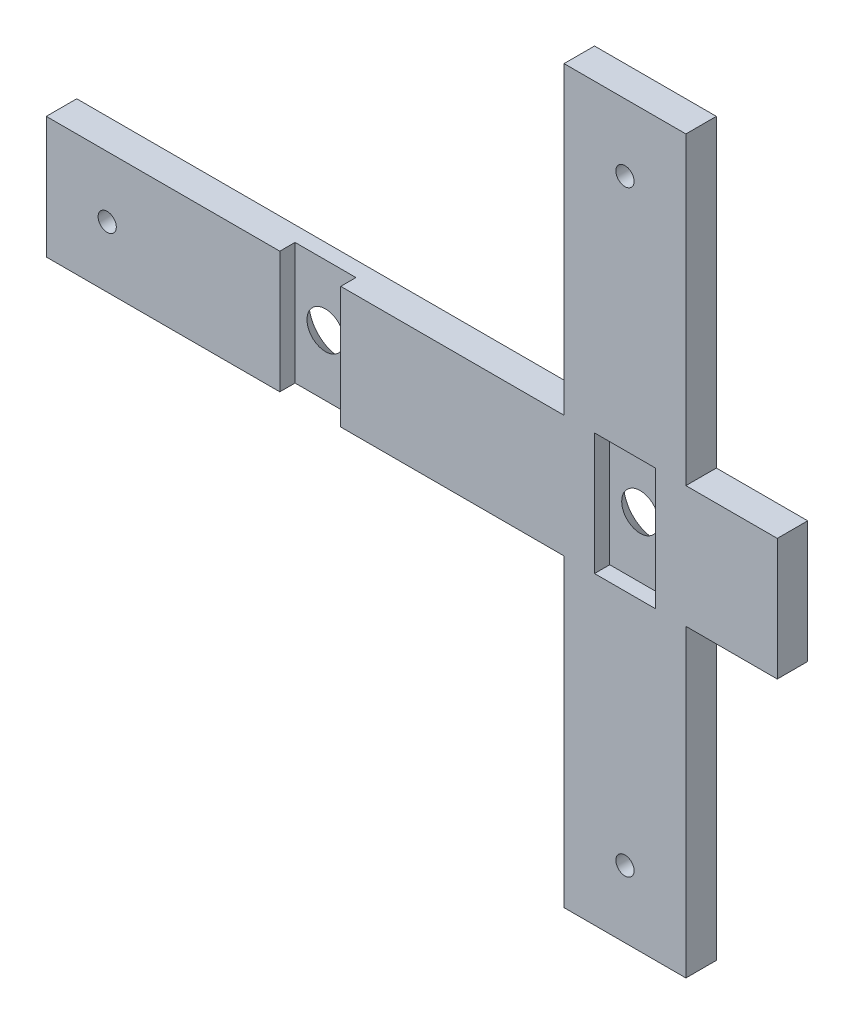
ISO-10303-21;
HEADER;
FILE_DESCRIPTION(('STEP AP214'),'2;1');
FILE_NAME('part.step','',(''),(''),'','','');
FILE_SCHEMA(('AUTOMOTIVE_DESIGN { 1 0 10303 214 1 1 1 1 }'));
ENDSEC;
DATA;
#1=APPLICATION_CONTEXT('core data for automotive mechanical design processes');
#2=APPLICATION_PROTOCOL_DEFINITION('international standard','automotive_design',2000,#1);
#3=PRODUCT_CONTEXT('',#1,'mechanical');
#4=PRODUCT('Part','Part','',(#3));
#5=PRODUCT_RELATED_PRODUCT_CATEGORY('part','',(#4));
#6=PRODUCT_DEFINITION_FORMATION('','',#4);
#7=PRODUCT_DEFINITION_CONTEXT('part definition',#1,'design');
#8=PRODUCT_DEFINITION('design','',#6,#7);
#9=PRODUCT_DEFINITION_SHAPE('','',#8);
#10=(LENGTH_UNIT() NAMED_UNIT(*) SI_UNIT(.MILLI.,.METRE.));
#11=(NAMED_UNIT(*) PLANE_ANGLE_UNIT() SI_UNIT($,.RADIAN.));
#12=(NAMED_UNIT(*) SI_UNIT($,.STERADIAN.) SOLID_ANGLE_UNIT());
#13=UNCERTAINTY_MEASURE_WITH_UNIT(LENGTH_MEASURE(1.E-05),#10,'distance_accuracy_value','');
#14=(GEOMETRIC_REPRESENTATION_CONTEXT(3) GLOBAL_UNCERTAINTY_ASSIGNED_CONTEXT((#13)) GLOBAL_UNIT_ASSIGNED_CONTEXT((#10,
#11,#12)) REPRESENTATION_CONTEXT('',''));
#15=CARTESIAN_POINT('',(0.,0.,0.));
#16=DIRECTION('',(0.,0.,1.));
#17=DIRECTION('',(1.,0.,0.));
#18=AXIS2_PLACEMENT_3D('',#15,#16,#17);
#19=CARTESIAN_POINT('',(44.4499999999993,-8.0538389204271E-06,0.));
#20=DIRECTION('',(0.,0.,-1.));
#21=DIRECTION('',(-1.,0.,0.));
#22=AXIS2_PLACEMENT_3D('',#19,#20,#21);
#23=CONICAL_SURFACE('',#22,6.61924,0.715584993317676);
#24=CARTESIAN_POINT('',(44.4499999999993,-8.0538389204271E-06,0.));
#25=DIRECTION('',(0.,0.,-1.));
#26=DIRECTION('',(-1.,0.,0.));
#27=AXIS2_PLACEMENT_3D('',#24,#25,#26);
#28=CIRCLE('',#27,6.61924);
#29=CARTESIAN_POINT('',(37.8307599999993,-8.0538389204271E-06,0.));
#30=VERTEX_POINT('',#29);
#31=EDGE_CURVE('E250',#30,#30,#28,.T.);
#32=ORIENTED_EDGE('',*,*,#31,.T.);
#33=EDGE_LOOP('',(#32));
#34=FACE_BOUND('',#33,.T.);
#35=CARTESIAN_POINT('',(44.4499999999993,-8.0538389204271E-06,3.175));
#36=DIRECTION('',(0.,0.,1.));
#37=DIRECTION('',(1.,0.,0.));
#38=AXIS2_PLACEMENT_3D('',#35,#36,#37);
#39=CIRCLE('',#38,3.85925460743345);
#40=CARTESIAN_POINT('',(48.3092546074328,-8.0538389204271E-06,3.175));
#41=VERTEX_POINT('',#40);
#42=EDGE_CURVE('E36',#41,#41,#39,.F.);
#43=ORIENTED_EDGE('',*,*,#42,.F.);
#44=EDGE_LOOP('',(#43));
#45=FACE_BOUND('',#44,.T.);
#46=ADVANCED_FACE('F32',(#34,#45),#23,.F.);
#47=CARTESIAN_POINT('',(-76.2,-76.2,6.35));
#48=DIRECTION('',(0.,0.,1.));
#49=DIRECTION('',(1.,0.,0.));
#50=AXIS2_PLACEMENT_3D('',#47,#48,#49);
#51=PLANE('',#50);
#52=DIRECTION('',(-1.,0.,0.));
#53=VECTOR('',#52,1.);
#54=CARTESIAN_POINT('',(50.8,12.7,6.35));
#55=LINE('',#54,#53);
#56=CARTESIAN_POINT('',(50.8,12.7,6.35));
#57=VERTEX_POINT('',#56);
#58=CARTESIAN_POINT('',(38.1,12.7,6.35));
#59=VERTEX_POINT('',#58);
#60=EDGE_CURVE('E49',#57,#59,#55,.T.);
#61=ORIENTED_EDGE('',*,*,#60,.F.);
#62=DIRECTION('',(0.,1.,0.));
#63=VECTOR('',#62,1.);
#64=CARTESIAN_POINT('',(50.8,-12.7,6.35));
#65=LINE('',#64,#63);
#66=CARTESIAN_POINT('',(50.8,-12.7,6.35));
#67=VERTEX_POINT('',#66);
#68=EDGE_CURVE('E193',#67,#57,#65,.T.);
#69=ORIENTED_EDGE('',*,*,#68,.F.);
#70=DIRECTION('',(1.,0.,0.));
#71=VECTOR('',#70,1.);
#72=CARTESIAN_POINT('',(38.1,-12.7,6.35));
#73=LINE('',#72,#71);
#74=CARTESIAN_POINT('',(38.1,-12.7,6.35));
#75=VERTEX_POINT('',#74);
#76=EDGE_CURVE('E196',#75,#67,#73,.T.);
#77=ORIENTED_EDGE('',*,*,#76,.F.);
#78=DIRECTION('',(0.,-1.,0.));
#79=VECTOR('',#78,1.);
#80=CARTESIAN_POINT('',(38.1,12.7,6.35));
#81=LINE('',#80,#79);
#82=EDGE_CURVE('E202',#59,#75,#81,.T.);
#83=ORIENTED_EDGE('',*,*,#82,.F.);
#84=EDGE_LOOP('',(#61,#69,#77,#83));
#85=FACE_BOUND('',#84,.T.);
#86=DIRECTION('',(0.,1.,0.));
#87=VECTOR('',#86,1.);
#88=CARTESIAN_POINT('',(-14.8107400000014,-12.7,6.35));
#89=LINE('',#88,#87);
#90=CARTESIAN_POINT('',(-14.8107400000014,-12.7,6.35));
#91=VERTEX_POINT('',#90);
#92=CARTESIAN_POINT('',(-14.8107400000014,12.6999999999869,6.35));
#93=VERTEX_POINT('',#92);
#94=EDGE_CURVE('E214',#91,#93,#89,.T.);
#95=ORIENTED_EDGE('',*,*,#94,.F.);
#96=DIRECTION('',(1.,0.,0.));
#97=VECTOR('',#96,1.);
#98=CARTESIAN_POINT('',(31.7499999999998,-12.7,6.35));
#99=LINE('',#98,#97);
#100=CARTESIAN_POINT('',(31.7499999999998,-12.7,6.35));
#101=VERTEX_POINT('',#100);
#102=EDGE_CURVE('E256',#91,#101,#99,.T.);
#103=ORIENTED_EDGE('',*,*,#102,.T.);
#104=DIRECTION('',(0.,-1.,0.));
#105=VECTOR('',#104,1.);
#106=CARTESIAN_POINT('',(31.7499999999998,-76.2,6.35));
#107=LINE('',#106,#105);
#108=CARTESIAN_POINT('',(31.7499999999998,-76.2,6.35));
#109=VERTEX_POINT('',#108);
#110=EDGE_CURVE('E282',#101,#109,#107,.T.);
#111=ORIENTED_EDGE('',*,*,#110,.T.);
#112=DIRECTION('',(1.,0.,0.));
#113=VECTOR('',#112,1.);
#114=CARTESIAN_POINT('',(-76.2,-76.2,6.35));
#115=LINE('',#114,#113);
#116=CARTESIAN_POINT('',(57.1499999999998,-76.2,6.35));
#117=VERTEX_POINT('',#116);
#118=EDGE_CURVE('E336',#109,#117,#115,.T.);
#119=ORIENTED_EDGE('',*,*,#118,.T.);
#120=DIRECTION('',(0.,1.,0.));
#121=VECTOR('',#120,1.);
#122=CARTESIAN_POINT('',(57.1499999999998,-12.7,6.35));
#123=LINE('',#122,#121);
#124=CARTESIAN_POINT('',(57.1499999999998,-12.7,6.35));
#125=VERTEX_POINT('',#124);
#126=EDGE_CURVE('E285',#117,#125,#123,.T.);
#127=ORIENTED_EDGE('',*,*,#126,.T.);
#128=DIRECTION('',(1.,0.,0.));
#129=VECTOR('',#128,1.);
#130=CARTESIAN_POINT('',(76.2,-12.7,6.35));
#131=LINE('',#130,#129);
#132=CARTESIAN_POINT('',(76.2,-12.7,6.35));
#133=VERTEX_POINT('',#132);
#134=EDGE_CURVE('E288',#125,#133,#131,.T.);
#135=ORIENTED_EDGE('',*,*,#134,.T.);
#136=DIRECTION('',(0.,1.,0.));
#137=VECTOR('',#136,1.);
#138=CARTESIAN_POINT('',(76.2,76.2,6.35));
#139=LINE('',#138,#137);
#140=CARTESIAN_POINT('',(76.2,12.7,6.35));
#141=VERTEX_POINT('',#140);
#142=EDGE_CURVE('E41',#133,#141,#139,.T.);
#143=ORIENTED_EDGE('',*,*,#142,.T.);
#144=DIRECTION('',(-1.,-6.84601107212256E-13,0.));
#145=VECTOR('',#144,1.);
#146=CARTESIAN_POINT('',(57.1499999999998,12.6999999999869,6.35));
#147=LINE('',#146,#145);
#148=CARTESIAN_POINT('',(57.1499999999998,12.6999999999869,6.35));
#149=VERTEX_POINT('',#148);
#150=EDGE_CURVE('E291',#141,#149,#147,.T.);
#151=ORIENTED_EDGE('',*,*,#150,.T.);
#152=DIRECTION('',(0.,1.,0.));
#153=VECTOR('',#152,1.);
#154=CARTESIAN_POINT('',(57.1499999999998,76.2,6.35));
#155=LINE('',#154,#153);
#156=CARTESIAN_POINT('',(57.1499999999998,76.2,6.35));
#157=VERTEX_POINT('',#156);
#158=EDGE_CURVE('E294',#149,#157,#155,.T.);
#159=ORIENTED_EDGE('',*,*,#158,.T.);
#160=DIRECTION('',(-1.,0.,0.));
#161=VECTOR('',#160,1.);
#162=CARTESIAN_POINT('',(-76.2,76.2,6.35));
#163=LINE('',#162,#161);
#164=CARTESIAN_POINT('',(31.7499999999998,76.2,6.35));
#165=VERTEX_POINT('',#164);
#166=EDGE_CURVE('E12',#157,#165,#163,.T.);
#167=ORIENTED_EDGE('',*,*,#166,.T.);
#168=DIRECTION('',(0.,-1.,0.));
#169=VECTOR('',#168,1.);
#170=CARTESIAN_POINT('',(31.7499999999998,12.6999999999869,6.35));
#171=LINE('',#170,#169);
#172=CARTESIAN_POINT('',(31.7499999999998,12.6999999999869,6.35));
#173=VERTEX_POINT('',#172);
#174=EDGE_CURVE('E297',#165,#173,#171,.T.);
#175=ORIENTED_EDGE('',*,*,#174,.T.);
#176=DIRECTION('',(-1.,1.20940517648925E-13,0.));
#177=VECTOR('',#176,1.);
#178=CARTESIAN_POINT('',(-76.2,12.7,6.35));
#179=LINE('',#178,#177);
#180=EDGE_CURVE('E261',#173,#93,#179,.T.);
#181=ORIENTED_EDGE('',*,*,#180,.T.);
#182=EDGE_LOOP('',(#95,#103,#111,#119,#127,#135,#143,#151,#159,#167,#175,#181));
#183=FACE_BOUND('',#182,.T.);
#184=CARTESIAN_POINT('',(44.4499999999998,-62.23,6.35));
#185=DIRECTION('',(0.,0.,1.));
#186=DIRECTION('',(1.,0.,0.));
#187=AXIS2_PLACEMENT_3D('',#184,#185,#186);
#188=CIRCLE('',#187,1.89864999999999);
#189=CARTESIAN_POINT('',(46.3486499999998,-62.23,6.35));
#190=VERTEX_POINT('',#189);
#191=EDGE_CURVE('E249',#190,#190,#188,.T.);
#192=ORIENTED_EDGE('',*,*,#191,.F.);
#193=EDGE_LOOP('',(#192));
#194=FACE_BOUND('',#193,.T.);
#195=CARTESIAN_POINT('',(44.4499999999998,62.23,6.35));
#196=DIRECTION('',(0.,0.,1.));
#197=DIRECTION('',(1.,0.,0.));
#198=AXIS2_PLACEMENT_3D('',#195,#196,#197);
#199=CIRCLE('',#198,1.89864999999999);
#200=CARTESIAN_POINT('',(46.3486499999998,62.23,6.35));
#201=VERTEX_POINT('',#200);
#202=EDGE_CURVE('E243',#201,#201,#199,.T.);
#203=ORIENTED_EDGE('',*,*,#202,.F.);
#204=EDGE_LOOP('',(#203));
#205=FACE_BOUND('',#204,.T.);
#206=ADVANCED_FACE('F361',(#85,#183,#194,#205),#51,.T.);
#207=CARTESIAN_POINT('',(-21.1607400000014,-8.05383890828404E-06,0.));
#208=DIRECTION('',(0.,0.,-1.));
#209=DIRECTION('',(-1.,0.,0.));
#210=AXIS2_PLACEMENT_3D('',#207,#208,#209);
#211=CONICAL_SURFACE('',#210,6.61924,0.715584993317675);
#212=CARTESIAN_POINT('',(-21.1607400000014,-8.05383890828404E-06,0.));
#213=DIRECTION('',(0.,0.,-1.));
#214=DIRECTION('',(-1.,0.,0.));
#215=AXIS2_PLACEMENT_3D('',#212,#213,#214);
#216=CIRCLE('',#215,6.61924);
#217=CARTESIAN_POINT('',(-27.7799800000014,-8.05383890828404E-06,0.));
#218=VERTEX_POINT('',#217);
#219=EDGE_CURVE('E253',#218,#218,#216,.T.);
#220=ORIENTED_EDGE('',*,*,#219,.T.);
#221=EDGE_LOOP('',(#220));
#222=FACE_BOUND('',#221,.T.);
#223=CARTESIAN_POINT('',(-21.1607400000014,-8.05383890828404E-06,3.175));
#224=DIRECTION('',(0.,0.,1.));
#225=DIRECTION('',(1.,0.,0.));
#226=AXIS2_PLACEMENT_3D('',#223,#224,#225);
#227=CIRCLE('',#226,3.85925460743346);
#228=CARTESIAN_POINT('',(-17.3014853925679,-8.05383890828404E-06,3.175));
#229=VERTEX_POINT('',#228);
#230=EDGE_CURVE('E225',#229,#229,#227,.F.);
#231=ORIENTED_EDGE('',*,*,#230,.F.);
#232=EDGE_LOOP('',(#231));
#233=FACE_BOUND('',#232,.T.);
#234=ADVANCED_FACE('F358',(#222,#233),#211,.F.);
#235=CARTESIAN_POINT('',(-76.2,-76.2,0.));
#236=DIRECTION('',(0.,0.,1.));
#237=DIRECTION('',(1.,0.,0.));
#238=AXIS2_PLACEMENT_3D('',#235,#236,#237);
#239=PLANE('',#238);
#240=DIRECTION('',(-1.,1.20940517648925E-13,0.));
#241=VECTOR('',#240,1.);
#242=CARTESIAN_POINT('',(-76.2,12.7,0.));
#243=LINE('',#242,#241);
#244=CARTESIAN_POINT('',(31.7499999999998,12.6999999999869,0.));
#245=VERTEX_POINT('',#244);
#246=CARTESIAN_POINT('',(-76.2,12.7,0.));
#247=VERTEX_POINT('',#246);
#248=EDGE_CURVE('E276',#245,#247,#243,.T.);
#249=ORIENTED_EDGE('',*,*,#248,.F.);
#250=DIRECTION('',(0.,-1.,0.));
#251=VECTOR('',#250,1.);
#252=CARTESIAN_POINT('',(31.7499999999998,12.6999999999869,0.));
#253=LINE('',#252,#251);
#254=CARTESIAN_POINT('',(31.7499999999998,76.2,0.));
#255=VERTEX_POINT('',#254);
#256=EDGE_CURVE('E273',#255,#245,#253,.T.);
#257=ORIENTED_EDGE('',*,*,#256,.F.);
#258=DIRECTION('',(-1.,0.,0.));
#259=VECTOR('',#258,1.);
#260=CARTESIAN_POINT('',(-76.2,76.2,0.));
#261=LINE('',#260,#259);
#262=CARTESIAN_POINT('',(57.1499999999998,76.2,0.));
#263=VERTEX_POINT('',#262);
#264=EDGE_CURVE('E337',#263,#255,#261,.T.);
#265=ORIENTED_EDGE('',*,*,#264,.F.);
#266=DIRECTION('',(0.,1.,0.));
#267=VECTOR('',#266,1.);
#268=CARTESIAN_POINT('',(57.1499999999998,76.2,0.));
#269=LINE('',#268,#267);
#270=CARTESIAN_POINT('',(57.1499999999998,12.6999999999869,0.));
#271=VERTEX_POINT('',#270);
#272=EDGE_CURVE('E271',#271,#263,#269,.T.);
#273=ORIENTED_EDGE('',*,*,#272,.F.);
#274=DIRECTION('',(-1.,-6.84601107212256E-13,0.));
#275=VECTOR('',#274,1.);
#276=CARTESIAN_POINT('',(57.1499999999998,12.6999999999869,0.));
#277=LINE('',#276,#275);
#278=CARTESIAN_POINT('',(76.2,12.7,0.));
#279=VERTEX_POINT('',#278);
#280=EDGE_CURVE('E268',#279,#271,#277,.T.);
#281=ORIENTED_EDGE('',*,*,#280,.F.);
#282=DIRECTION('',(0.,1.,0.));
#283=VECTOR('',#282,1.);
#284=CARTESIAN_POINT('',(76.2,76.2,0.));
#285=LINE('',#284,#283);
#286=CARTESIAN_POINT('',(76.2,-12.7,0.));
#287=VERTEX_POINT('',#286);
#288=EDGE_CURVE('E347',#287,#279,#285,.T.);
#289=ORIENTED_EDGE('',*,*,#288,.F.);
#290=DIRECTION('',(1.,0.,0.));
#291=VECTOR('',#290,1.);
#292=CARTESIAN_POINT('',(76.2,-12.7,0.));
#293=LINE('',#292,#291);
#294=CARTESIAN_POINT('',(57.1499999999998,-12.7,0.));
#295=VERTEX_POINT('',#294);
#296=EDGE_CURVE('E266',#295,#287,#293,.T.);
#297=ORIENTED_EDGE('',*,*,#296,.F.);
#298=DIRECTION('',(0.,1.,0.));
#299=VECTOR('',#298,1.);
#300=CARTESIAN_POINT('',(57.1499999999998,-12.7,0.));
#301=LINE('',#300,#299);
#302=CARTESIAN_POINT('',(57.1499999999998,-76.2,0.));
#303=VERTEX_POINT('',#302);
#304=EDGE_CURVE('E263',#303,#295,#301,.T.);
#305=ORIENTED_EDGE('',*,*,#304,.F.);
#306=DIRECTION('',(1.,0.,0.));
#307=VECTOR('',#306,1.);
#308=CARTESIAN_POINT('',(-76.2,-76.2,0.));
#309=LINE('',#308,#307);
#310=CARTESIAN_POINT('',(31.7499999999998,-76.2,0.));
#311=VERTEX_POINT('',#310);
#312=EDGE_CURVE('E344',#311,#303,#309,.T.);
#313=ORIENTED_EDGE('',*,*,#312,.F.);
#314=DIRECTION('',(0.,-1.,0.));
#315=VECTOR('',#314,1.);
#316=CARTESIAN_POINT('',(31.7499999999998,-76.2,0.));
#317=LINE('',#316,#315);
#318=CARTESIAN_POINT('',(31.7499999999998,-12.7,0.));
#319=VERTEX_POINT('',#318);
#320=EDGE_CURVE('E260',#319,#311,#317,.T.);
#321=ORIENTED_EDGE('',*,*,#320,.F.);
#322=DIRECTION('',(1.,0.,0.));
#323=VECTOR('',#322,1.);
#324=CARTESIAN_POINT('',(31.7499999999998,-12.7,0.));
#325=LINE('',#324,#323);
#326=CARTESIAN_POINT('',(-76.2,-12.7,0.));
#327=VERTEX_POINT('',#326);
#328=EDGE_CURVE('E257',#327,#319,#325,.T.);
#329=ORIENTED_EDGE('',*,*,#328,.F.);
#330=DIRECTION('',(0.,-1.,0.));
#331=VECTOR('',#330,1.);
#332=CARTESIAN_POINT('',(-76.2,76.2,0.));
#333=LINE('',#332,#331);
#334=EDGE_CURVE('E306',#247,#327,#333,.T.);
#335=ORIENTED_EDGE('',*,*,#334,.F.);
#336=EDGE_LOOP('',(#249,#257,#265,#273,#281,#289,#297,#305,#313,#321,#329,#335));
#337=FACE_BOUND('',#336,.T.);
#338=ORIENTED_EDGE('',*,*,#219,.F.);
#339=EDGE_LOOP('',(#338));
#340=FACE_BOUND('',#339,.T.);
#341=ORIENTED_EDGE('',*,*,#31,.F.);
#342=EDGE_LOOP('',(#341));
#343=FACE_BOUND('',#342,.T.);
#344=CARTESIAN_POINT('',(44.4499999999998,-62.23,0.));
#345=DIRECTION('',(0.,0.,-1.));
#346=DIRECTION('',(-1.,0.,0.));
#347=AXIS2_PLACEMENT_3D('',#344,#345,#346);
#348=CIRCLE('',#347,1.89864999999999);
#349=CARTESIAN_POINT('',(42.5513499999998,-62.23,0.));
#350=VERTEX_POINT('',#349);
#351=EDGE_CURVE('E246',#350,#350,#348,.T.);
#352=ORIENTED_EDGE('',*,*,#351,.F.);
#353=EDGE_LOOP('',(#352));
#354=FACE_BOUND('',#353,.T.);
#355=CARTESIAN_POINT('',(44.4499999999998,62.23,0.));
#356=DIRECTION('',(0.,0.,-1.));
#357=DIRECTION('',(-1.,0.,0.));
#358=AXIS2_PLACEMENT_3D('',#355,#356,#357);
#359=CIRCLE('',#358,1.89864999999999);
#360=CARTESIAN_POINT('',(42.5513499999998,62.23,0.));
#361=VERTEX_POINT('',#360);
#362=EDGE_CURVE('E240',#361,#361,#359,.T.);
#363=ORIENTED_EDGE('',*,*,#362,.F.);
#364=EDGE_LOOP('',(#363));
#365=FACE_BOUND('',#364,.T.);
#366=CARTESIAN_POINT('',(-63.5,0.,0.));
#367=DIRECTION('',(0.,0.,-1.));
#368=DIRECTION('',(-1.,0.,0.));
#369=AXIS2_PLACEMENT_3D('',#366,#367,#368);
#370=CIRCLE('',#369,1.89864999999999);
#371=CARTESIAN_POINT('',(-65.39865,0.,0.));
#372=VERTEX_POINT('',#371);
#373=EDGE_CURVE('E234',#372,#372,#370,.T.);
#374=ORIENTED_EDGE('',*,*,#373,.F.);
#375=EDGE_LOOP('',(#374));
#376=FACE_BOUND('',#375,.T.);
#377=ADVANCED_FACE('F360',(#337,#340,#343,#354,#365,#376),#239,.F.);
#378=CARTESIAN_POINT('',(-76.2,76.2,6.35));
#379=DIRECTION('',(1.,0.,0.));
#380=DIRECTION('',(0.,0.,-1.));
#381=AXIS2_PLACEMENT_3D('',#378,#379,#380);
#382=PLANE('',#381);
#383=DIRECTION('',(0.,0.,1.));
#384=VECTOR('',#383,1.);
#385=CARTESIAN_POINT('',(-76.2,12.7,0.));
#386=LINE('',#385,#384);
#387=CARTESIAN_POINT('',(-76.2,12.7,6.35));
#388=VERTEX_POINT('',#387);
#389=EDGE_CURVE('E303',#247,#388,#386,.T.);
#390=ORIENTED_EDGE('',*,*,#389,.F.);
#391=ORIENTED_EDGE('',*,*,#334,.T.);
#392=DIRECTION('',(0.,0.,1.));
#393=VECTOR('',#392,1.);
#394=CARTESIAN_POINT('',(-76.2,-12.7,0.));
#395=LINE('',#394,#393);
#396=CARTESIAN_POINT('',(-76.2,-12.7,6.35));
#397=VERTEX_POINT('',#396);
#398=EDGE_CURVE('E278',#327,#397,#395,.T.);
#399=ORIENTED_EDGE('',*,*,#398,.T.);
#400=DIRECTION('',(0.,-1.,0.));
#401=VECTOR('',#400,1.);
#402=CARTESIAN_POINT('',(-76.2,76.2,6.35));
#403=LINE('',#402,#401);
#404=EDGE_CURVE('E333',#388,#397,#403,.T.);
#405=ORIENTED_EDGE('',*,*,#404,.F.);
#406=EDGE_LOOP('',(#390,#391,#399,#405));
#407=FACE_BOUND('',#406,.T.);
#408=ADVANCED_FACE('F34',(#407),#382,.F.);
#409=CARTESIAN_POINT('',(-76.2,-76.2,6.35));
#410=DIRECTION('',(0.,1.,0.));
#411=DIRECTION('',(0.,0.,1.));
#412=AXIS2_PLACEMENT_3D('',#409,#410,#411);
#413=PLANE('',#412);
#414=DIRECTION('',(0.,0.,1.));
#415=VECTOR('',#414,1.);
#416=CARTESIAN_POINT('',(57.1499999999998,-76.2,0.));
#417=LINE('',#416,#415);
#418=EDGE_CURVE('E323',#303,#117,#417,.T.);
#419=ORIENTED_EDGE('',*,*,#418,.T.);
#420=ORIENTED_EDGE('',*,*,#118,.F.);
#421=DIRECTION('',(0.,0.,1.));
#422=VECTOR('',#421,1.);
#423=CARTESIAN_POINT('',(31.7499999999998,-76.2,0.));
#424=LINE('',#423,#422);
#425=EDGE_CURVE('E326',#311,#109,#424,.T.);
#426=ORIENTED_EDGE('',*,*,#425,.F.);
#427=ORIENTED_EDGE('',*,*,#312,.T.);
#428=EDGE_LOOP('',(#419,#420,#426,#427));
#429=FACE_BOUND('',#428,.T.);
#430=ADVANCED_FACE('F574',(#429),#413,.F.);
#431=CARTESIAN_POINT('',(76.2,76.2,6.35));
#432=DIRECTION('',(-1.,0.,0.));
#433=DIRECTION('',(0.,-1.,0.));
#434=AXIS2_PLACEMENT_3D('',#431,#432,#433);
#435=PLANE('',#434);
#436=DIRECTION('',(0.,0.,1.));
#437=VECTOR('',#436,1.);
#438=CARTESIAN_POINT('',(76.2,12.7,0.));
#439=LINE('',#438,#437);
#440=EDGE_CURVE('E316',#279,#141,#439,.T.);
#441=ORIENTED_EDGE('',*,*,#440,.T.);
#442=ORIENTED_EDGE('',*,*,#142,.F.);
#443=DIRECTION('',(0.,0.,1.));
#444=VECTOR('',#443,1.);
#445=CARTESIAN_POINT('',(76.2,-12.7,0.));
#446=LINE('',#445,#444);
#447=EDGE_CURVE('E319',#287,#133,#446,.T.);
#448=ORIENTED_EDGE('',*,*,#447,.F.);
#449=ORIENTED_EDGE('',*,*,#288,.T.);
#450=EDGE_LOOP('',(#441,#442,#448,#449));
#451=FACE_BOUND('',#450,.T.);
#452=ADVANCED_FACE('F582',(#451),#435,.F.);
#453=CARTESIAN_POINT('',(-76.2,76.2,6.35));
#454=DIRECTION('',(0.,-1.,0.));
#455=DIRECTION('',(0.,0.,-1.));
#456=AXIS2_PLACEMENT_3D('',#453,#454,#455);
#457=PLANE('',#456);
#458=DIRECTION('',(0.,0.,1.));
#459=VECTOR('',#458,1.);
#460=CARTESIAN_POINT('',(31.7499999999998,76.2,0.));
#461=LINE('',#460,#459);
#462=EDGE_CURVE('E309',#255,#165,#461,.T.);
#463=ORIENTED_EDGE('',*,*,#462,.T.);
#464=ORIENTED_EDGE('',*,*,#166,.F.);
#465=DIRECTION('',(0.,0.,1.));
#466=VECTOR('',#465,1.);
#467=CARTESIAN_POINT('',(57.1499999999998,76.2,0.));
#468=LINE('',#467,#466);
#469=EDGE_CURVE('E312',#263,#157,#468,.T.);
#470=ORIENTED_EDGE('',*,*,#469,.F.);
#471=ORIENTED_EDGE('',*,*,#264,.T.);
#472=EDGE_LOOP('',(#463,#464,#470,#471));
#473=FACE_BOUND('',#472,.T.);
#474=ADVANCED_FACE('F590',(#473),#457,.F.);
#475=DIRECTION('',(0.,-1.,0.));
#476=VECTOR('',#475,1.);
#477=CARTESIAN_POINT('',(-27.5107400000014,12.6999999999869,6.35));
#478=LINE('',#477,#476);
#479=CARTESIAN_POINT('',(-27.5107400000014,12.6999999999869,6.35));
#480=VERTEX_POINT('',#479);
#481=CARTESIAN_POINT('',(-27.5107400000014,-12.7,6.35));
#482=VERTEX_POINT('',#481);
#483=EDGE_CURVE('E219',#480,#482,#478,.T.);
#484=ORIENTED_EDGE('',*,*,#483,.F.);
#485=EDGE_CURVE('E300',#480,#388,#179,.T.);
#486=ORIENTED_EDGE('',*,*,#485,.T.);
#487=ORIENTED_EDGE('',*,*,#404,.T.);
#488=EDGE_CURVE('E279',#397,#482,#99,.T.);
#489=ORIENTED_EDGE('',*,*,#488,.T.);
#490=EDGE_LOOP('',(#484,#486,#487,#489));
#491=FACE_BOUND('',#490,.T.);
#492=CARTESIAN_POINT('',(-63.5,0.,6.35));
#493=DIRECTION('',(0.,0.,1.));
#494=DIRECTION('',(1.,0.,0.));
#495=AXIS2_PLACEMENT_3D('',#492,#493,#494);
#496=CIRCLE('',#495,1.89864999999999);
#497=CARTESIAN_POINT('',(-61.60135,0.,6.35));
#498=VERTEX_POINT('',#497);
#499=EDGE_CURVE('E237',#498,#498,#496,.T.);
#500=ORIENTED_EDGE('',*,*,#499,.F.);
#501=EDGE_LOOP('',(#500));
#502=FACE_BOUND('',#501,.T.);
#503=ADVANCED_FACE('F372',(#491,#502),#51,.T.);
#504=CARTESIAN_POINT('',(31.7499999999998,-12.7,0.));
#505=DIRECTION('',(0.,-1.,0.));
#506=DIRECTION('',(1.,0.,0.));
#507=AXIS2_PLACEMENT_3D('',#504,#505,#506);
#508=PLANE('',#507);
#509=DIRECTION('',(0.,0.,1.));
#510=VECTOR('',#509,1.);
#511=CARTESIAN_POINT('',(-14.8107400000014,-12.7,3.175));
#512=LINE('',#511,#510);
#513=CARTESIAN_POINT('',(-14.8107400000014,-12.7,3.175));
#514=VERTEX_POINT('',#513);
#515=EDGE_CURVE('E226',#514,#91,#512,.T.);
#516=ORIENTED_EDGE('',*,*,#515,.F.);
#517=DIRECTION('',(-1.,0.,0.));
#518=VECTOR('',#517,1.);
#519=CARTESIAN_POINT('',(31.7499999999998,-12.7,3.175));
#520=LINE('',#519,#518);
#521=CARTESIAN_POINT('',(-27.5107400000014,-12.7,3.175));
#522=VERTEX_POINT('',#521);
#523=EDGE_CURVE('E229',#514,#522,#520,.T.);
#524=ORIENTED_EDGE('',*,*,#523,.T.);
#525=DIRECTION('',(0.,0.,-1.));
#526=VECTOR('',#525,1.);
#527=CARTESIAN_POINT('',(-27.5107400000014,-12.7,0.));
#528=LINE('',#527,#526);
#529=EDGE_CURVE('E232',#482,#522,#528,.T.);
#530=ORIENTED_EDGE('',*,*,#529,.F.);
#531=ORIENTED_EDGE('',*,*,#488,.F.);
#532=ORIENTED_EDGE('',*,*,#398,.F.);
#533=ORIENTED_EDGE('',*,*,#328,.T.);
#534=DIRECTION('',(0.,0.,1.));
#535=VECTOR('',#534,1.);
#536=CARTESIAN_POINT('',(31.7499999999998,-12.7,0.));
#537=LINE('',#536,#535);
#538=EDGE_CURVE('E328',#319,#101,#537,.T.);
#539=ORIENTED_EDGE('',*,*,#538,.T.);
#540=ORIENTED_EDGE('',*,*,#102,.F.);
#541=EDGE_LOOP('',(#516,#524,#530,#531,#532,#533,#539,#540));
#542=FACE_BOUND('',#541,.T.);
#543=ADVANCED_FACE('F557',(#542),#508,.T.);
#544=CARTESIAN_POINT('',(31.7499999999998,-76.2,0.));
#545=DIRECTION('',(-1.,0.,0.));
#546=DIRECTION('',(0.,0.,1.));
#547=AXIS2_PLACEMENT_3D('',#544,#545,#546);
#548=PLANE('',#547);
#549=ORIENTED_EDGE('',*,*,#110,.F.);
#550=ORIENTED_EDGE('',*,*,#538,.F.);
#551=ORIENTED_EDGE('',*,*,#320,.T.);
#552=ORIENTED_EDGE('',*,*,#425,.T.);
#553=EDGE_LOOP('',(#549,#550,#551,#552));
#554=FACE_BOUND('',#553,.T.);
#555=ADVANCED_FACE('F548',(#554),#548,.T.);
#556=CARTESIAN_POINT('',(57.1499999999998,-12.7,0.));
#557=DIRECTION('',(1.,0.,0.));
#558=DIRECTION('',(0.,1.,0.));
#559=AXIS2_PLACEMENT_3D('',#556,#557,#558);
#560=PLANE('',#559);
#561=ORIENTED_EDGE('',*,*,#126,.F.);
#562=ORIENTED_EDGE('',*,*,#418,.F.);
#563=ORIENTED_EDGE('',*,*,#304,.T.);
#564=DIRECTION('',(0.,0.,1.));
#565=VECTOR('',#564,1.);
#566=CARTESIAN_POINT('',(57.1499999999998,-12.7,0.));
#567=LINE('',#566,#565);
#568=EDGE_CURVE('E321',#295,#125,#567,.T.);
#569=ORIENTED_EDGE('',*,*,#568,.T.);
#570=EDGE_LOOP('',(#561,#562,#563,#569));
#571=FACE_BOUND('',#570,.T.);
#572=ADVANCED_FACE('F539',(#571),#560,.T.);
#573=CARTESIAN_POINT('',(76.2,-12.7,0.));
#574=DIRECTION('',(0.,-1.,0.));
#575=DIRECTION('',(0.,0.,-1.));
#576=AXIS2_PLACEMENT_3D('',#573,#574,#575);
#577=PLANE('',#576);
#578=ORIENTED_EDGE('',*,*,#134,.F.);
#579=ORIENTED_EDGE('',*,*,#568,.F.);
#580=ORIENTED_EDGE('',*,*,#296,.T.);
#581=ORIENTED_EDGE('',*,*,#447,.T.);
#582=EDGE_LOOP('',(#578,#579,#580,#581));
#583=FACE_BOUND('',#582,.T.);
#584=ADVANCED_FACE('F530',(#583),#577,.T.);
#585=CARTESIAN_POINT('',(57.1499999999998,12.6999999999869,0.));
#586=DIRECTION('',(-6.84601107212257E-13,1.,0.));
#587=DIRECTION('',(-1.,-6.84601107212257E-13,0.));
#588=AXIS2_PLACEMENT_3D('',#585,#586,#587);
#589=PLANE('',#588);
#590=ORIENTED_EDGE('',*,*,#150,.F.);
#591=ORIENTED_EDGE('',*,*,#440,.F.);
#592=ORIENTED_EDGE('',*,*,#280,.T.);
#593=DIRECTION('',(0.,0.,1.));
#594=VECTOR('',#593,1.);
#595=CARTESIAN_POINT('',(57.1499999999998,12.6999999999869,0.));
#596=LINE('',#595,#594);
#597=EDGE_CURVE('E314',#271,#149,#596,.T.);
#598=ORIENTED_EDGE('',*,*,#597,.T.);
#599=EDGE_LOOP('',(#590,#591,#592,#598));
#600=FACE_BOUND('',#599,.T.);
#601=ADVANCED_FACE('F521',(#600),#589,.T.);
#602=CARTESIAN_POINT('',(57.1499999999998,76.2,0.));
#603=DIRECTION('',(1.,0.,0.));
#604=DIRECTION('',(0.,0.,-1.));
#605=AXIS2_PLACEMENT_3D('',#602,#603,#604);
#606=PLANE('',#605);
#607=ORIENTED_EDGE('',*,*,#158,.F.);
#608=ORIENTED_EDGE('',*,*,#597,.F.);
#609=ORIENTED_EDGE('',*,*,#272,.T.);
#610=ORIENTED_EDGE('',*,*,#469,.T.);
#611=EDGE_LOOP('',(#607,#608,#609,#610));
#612=FACE_BOUND('',#611,.T.);
#613=ADVANCED_FACE('F513',(#612),#606,.T.);
#614=CARTESIAN_POINT('',(-76.2,12.7,0.));
#615=DIRECTION('',(1.20940517648925E-13,1.,0.));
#616=DIRECTION('',(-1.,1.20940517648925E-13,0.));
#617=AXIS2_PLACEMENT_3D('',#614,#615,#616);
#618=PLANE('',#617);
#619=DIRECTION('',(0.,0.,1.));
#620=VECTOR('',#619,1.);
#621=CARTESIAN_POINT('',(-14.8107400000014,12.6999999999869,3.175));
#622=LINE('',#621,#620);
#623=CARTESIAN_POINT('',(-14.8107400000014,12.6999999999926,3.175));
#624=VERTEX_POINT('',#623);
#625=EDGE_CURVE('E222',#624,#93,#622,.T.);
#626=ORIENTED_EDGE('',*,*,#625,.T.);
#627=ORIENTED_EDGE('',*,*,#180,.F.);
#628=DIRECTION('',(0.,0.,1.));
#629=VECTOR('',#628,1.);
#630=CARTESIAN_POINT('',(31.7499999999998,12.6999999999869,0.));
#631=LINE('',#630,#629);
#632=EDGE_CURVE('E307',#245,#173,#631,.T.);
#633=ORIENTED_EDGE('',*,*,#632,.F.);
#634=ORIENTED_EDGE('',*,*,#248,.T.);
#635=ORIENTED_EDGE('',*,*,#389,.T.);
#636=ORIENTED_EDGE('',*,*,#485,.F.);
#637=DIRECTION('',(0.,0.,1.));
#638=VECTOR('',#637,1.);
#639=CARTESIAN_POINT('',(-27.5107400000014,12.6999999999869,3.175));
#640=LINE('',#639,#638);
#641=CARTESIAN_POINT('',(-27.5107400000014,12.6999999999869,3.175));
#642=VERTEX_POINT('',#641);
#643=EDGE_CURVE('E218',#642,#480,#640,.T.);
#644=ORIENTED_EDGE('',*,*,#643,.F.);
#645=DIRECTION('',(-1.,0.,0.));
#646=VECTOR('',#645,1.);
#647=CARTESIAN_POINT('',(-14.8107400000014,12.6999999999869,3.175));
#648=LINE('',#647,#646);
#649=EDGE_CURVE('E211',#624,#642,#648,.T.);
#650=ORIENTED_EDGE('',*,*,#649,.F.);
#651=EDGE_LOOP('',(#626,#627,#633,#634,#635,#636,#644,#650));
#652=FACE_BOUND('',#651,.T.);
#653=ADVANCED_FACE('F504',(#652),#618,.T.);
#654=CARTESIAN_POINT('',(31.7499999999998,12.6999999999869,0.));
#655=DIRECTION('',(-1.,0.,0.));
#656=DIRECTION('',(0.,0.,1.));
#657=AXIS2_PLACEMENT_3D('',#654,#655,#656);
#658=PLANE('',#657);
#659=ORIENTED_EDGE('',*,*,#174,.F.);
#660=ORIENTED_EDGE('',*,*,#462,.F.);
#661=ORIENTED_EDGE('',*,*,#256,.T.);
#662=ORIENTED_EDGE('',*,*,#632,.T.);
#663=EDGE_LOOP('',(#659,#660,#661,#662));
#664=FACE_BOUND('',#663,.T.);
#665=ADVANCED_FACE('F385',(#664),#658,.T.);
#666=CARTESIAN_POINT('',(44.4499999999998,-62.23,0.));
#667=DIRECTION('',(0.,0.,-1.));
#668=DIRECTION('',(-1.,0.,0.));
#669=AXIS2_PLACEMENT_3D('',#666,#667,#668);
#670=CYLINDRICAL_SURFACE('',#669,1.89864999999999);
#671=ORIENTED_EDGE('',*,*,#191,.T.);
#672=EDGE_LOOP('',(#671));
#673=FACE_BOUND('',#672,.T.);
#674=ORIENTED_EDGE('',*,*,#351,.T.);
#675=EDGE_LOOP('',(#674));
#676=FACE_BOUND('',#675,.T.);
#677=ADVANCED_FACE('F381',(#673,#676),#670,.F.);
#678=CARTESIAN_POINT('',(44.4499999999998,62.23,0.));
#679=DIRECTION('',(0.,0.,-1.));
#680=DIRECTION('',(-1.,0.,0.));
#681=AXIS2_PLACEMENT_3D('',#678,#679,#680);
#682=CYLINDRICAL_SURFACE('',#681,1.89864999999999);
#683=ORIENTED_EDGE('',*,*,#202,.T.);
#684=EDGE_LOOP('',(#683));
#685=FACE_BOUND('',#684,.T.);
#686=ORIENTED_EDGE('',*,*,#362,.T.);
#687=EDGE_LOOP('',(#686));
#688=FACE_BOUND('',#687,.T.);
#689=ADVANCED_FACE('F384',(#685,#688),#682,.F.);
#690=CARTESIAN_POINT('',(-63.5,0.,0.));
#691=DIRECTION('',(0.,0.,-1.));
#692=DIRECTION('',(-1.,0.,0.));
#693=AXIS2_PLACEMENT_3D('',#690,#691,#692);
#694=CYLINDRICAL_SURFACE('',#693,1.89864999999999);
#695=ORIENTED_EDGE('',*,*,#499,.T.);
#696=EDGE_LOOP('',(#695));
#697=FACE_BOUND('',#696,.T.);
#698=ORIENTED_EDGE('',*,*,#373,.T.);
#699=EDGE_LOOP('',(#698));
#700=FACE_BOUND('',#699,.T.);
#701=ADVANCED_FACE('F389',(#697,#700),#694,.F.);
#702=CARTESIAN_POINT('',(-27.5107400000014,12.6999999999869,3.175));
#703=DIRECTION('',(0.,0.,1.));
#704=DIRECTION('',(1.,0.,0.));
#705=AXIS2_PLACEMENT_3D('',#702,#703,#704);
#706=PLANE('',#705);
#707=DIRECTION('',(0.,1.,0.));
#708=VECTOR('',#707,1.);
#709=CARTESIAN_POINT('',(-14.8107400000014,-12.7,3.175));
#710=LINE('',#709,#708);
#711=EDGE_CURVE('E57',#514,#624,#710,.T.);
#712=ORIENTED_EDGE('',*,*,#711,.T.);
#713=ORIENTED_EDGE('',*,*,#649,.T.);
#714=DIRECTION('',(0.,-1.,0.));
#715=VECTOR('',#714,1.);
#716=CARTESIAN_POINT('',(-27.5107400000014,12.6999999999869,3.175));
#717=LINE('',#716,#715);
#718=EDGE_CURVE('E213',#642,#522,#717,.T.);
#719=ORIENTED_EDGE('',*,*,#718,.T.);
#720=ORIENTED_EDGE('',*,*,#523,.F.);
#721=EDGE_LOOP('',(#712,#713,#719,#720));
#722=FACE_BOUND('',#721,.T.);
#723=ORIENTED_EDGE('',*,*,#230,.T.);
#724=EDGE_LOOP('',(#723));
#725=FACE_BOUND('',#724,.T.);
#726=ADVANCED_FACE('F356',(#722,#725),#706,.T.);
#727=CARTESIAN_POINT('',(-14.8107400000014,-12.7,3.175));
#728=DIRECTION('',(1.,0.,0.));
#729=DIRECTION('',(0.,0.,-1.));
#730=AXIS2_PLACEMENT_3D('',#727,#728,#729);
#731=PLANE('',#730);
#732=ORIENTED_EDGE('',*,*,#94,.T.);
#733=ORIENTED_EDGE('',*,*,#625,.F.);
#734=ORIENTED_EDGE('',*,*,#711,.F.);
#735=ORIENTED_EDGE('',*,*,#515,.T.);
#736=EDGE_LOOP('',(#732,#733,#734,#735));
#737=FACE_BOUND('',#736,.T.);
#738=ADVANCED_FACE('F397',(#737),#731,.F.);
#739=CARTESIAN_POINT('',(-27.5107400000014,12.6999999999869,3.175));
#740=DIRECTION('',(-1.,0.,0.));
#741=DIRECTION('',(0.,0.,1.));
#742=AXIS2_PLACEMENT_3D('',#739,#740,#741);
#743=PLANE('',#742);
#744=ORIENTED_EDGE('',*,*,#529,.T.);
#745=ORIENTED_EDGE('',*,*,#718,.F.);
#746=ORIENTED_EDGE('',*,*,#643,.T.);
#747=ORIENTED_EDGE('',*,*,#483,.T.);
#748=EDGE_LOOP('',(#744,#745,#746,#747));
#749=FACE_BOUND('',#748,.T.);
#750=ADVANCED_FACE('F394',(#749),#743,.F.);
#751=CARTESIAN_POINT('',(38.1,12.7,3.175));
#752=DIRECTION('',(0.,0.,1.));
#753=DIRECTION('',(1.,0.,0.));
#754=AXIS2_PLACEMENT_3D('',#751,#752,#753);
#755=PLANE('',#754);
#756=DIRECTION('',(-1.,0.,0.));
#757=VECTOR('',#756,1.);
#758=CARTESIAN_POINT('',(50.8,12.7,3.175));
#759=LINE('',#758,#757);
#760=CARTESIAN_POINT('',(50.8,12.7,3.175));
#761=VERTEX_POINT('',#760);
#762=CARTESIAN_POINT('',(38.1,12.7,3.175));
#763=VERTEX_POINT('',#762);
#764=EDGE_CURVE('E174',#761,#763,#759,.T.);
#765=ORIENTED_EDGE('',*,*,#764,.T.);
#766=DIRECTION('',(0.,-1.,0.));
#767=VECTOR('',#766,1.);
#768=CARTESIAN_POINT('',(38.1,12.7,3.175));
#769=LINE('',#768,#767);
#770=CARTESIAN_POINT('',(38.1,-12.7,3.175));
#771=VERTEX_POINT('',#770);
#772=EDGE_CURVE('E183',#763,#771,#769,.T.);
#773=ORIENTED_EDGE('',*,*,#772,.T.);
#774=DIRECTION('',(1.,0.,0.));
#775=VECTOR('',#774,1.);
#776=CARTESIAN_POINT('',(38.1,-12.7,3.175));
#777=LINE('',#776,#775);
#778=CARTESIAN_POINT('',(50.8,-12.7,3.175));
#779=VERTEX_POINT('',#778);
#780=EDGE_CURVE('E188',#771,#779,#777,.T.);
#781=ORIENTED_EDGE('',*,*,#780,.T.);
#782=DIRECTION('',(0.,1.,0.));
#783=VECTOR('',#782,1.);
#784=CARTESIAN_POINT('',(50.8,-12.7,3.175));
#785=LINE('',#784,#783);
#786=EDGE_CURVE('E180',#779,#761,#785,.T.);
#787=ORIENTED_EDGE('',*,*,#786,.T.);
#788=EDGE_LOOP('',(#765,#773,#781,#787));
#789=FACE_BOUND('',#788,.T.);
#790=ORIENTED_EDGE('',*,*,#42,.T.);
#791=EDGE_LOOP('',(#790));
#792=FACE_BOUND('',#791,.T.);
#793=ADVANCED_FACE('F190',(#789,#792),#755,.T.);
#794=CARTESIAN_POINT('',(50.8,12.7,3.175));
#795=DIRECTION('',(0.,1.,0.));
#796=DIRECTION('',(-1.,0.,0.));
#797=AXIS2_PLACEMENT_3D('',#794,#795,#796);
#798=PLANE('',#797);
#799=ORIENTED_EDGE('',*,*,#60,.T.);
#800=DIRECTION('',(0.,0.,1.));
#801=VECTOR('',#800,1.);
#802=CARTESIAN_POINT('',(38.1,12.7,3.175));
#803=LINE('',#802,#801);
#804=EDGE_CURVE('E170',#763,#59,#803,.T.);
#805=ORIENTED_EDGE('',*,*,#804,.F.);
#806=ORIENTED_EDGE('',*,*,#764,.F.);
#807=DIRECTION('',(0.,0.,1.));
#808=VECTOR('',#807,1.);
#809=CARTESIAN_POINT('',(50.8,12.7,3.175));
#810=LINE('',#809,#808);
#811=EDGE_CURVE('E206',#761,#57,#810,.T.);
#812=ORIENTED_EDGE('',*,*,#811,.T.);
#813=EDGE_LOOP('',(#799,#805,#806,#812));
#814=FACE_BOUND('',#813,.T.);
#815=ADVANCED_FACE('F172',(#814),#798,.F.);
#816=CARTESIAN_POINT('',(50.8,-12.7,3.175));
#817=DIRECTION('',(1.,0.,0.));
#818=DIRECTION('',(0.,0.,-1.));
#819=AXIS2_PLACEMENT_3D('',#816,#817,#818);
#820=PLANE('',#819);
#821=ORIENTED_EDGE('',*,*,#68,.T.);
#822=ORIENTED_EDGE('',*,*,#811,.F.);
#823=ORIENTED_EDGE('',*,*,#786,.F.);
#824=DIRECTION('',(0.,0.,1.));
#825=VECTOR('',#824,1.);
#826=CARTESIAN_POINT('',(50.8,-12.7,3.175));
#827=LINE('',#826,#825);
#828=EDGE_CURVE('E208',#779,#67,#827,.T.);
#829=ORIENTED_EDGE('',*,*,#828,.T.);
#830=EDGE_LOOP('',(#821,#822,#823,#829));
#831=FACE_BOUND('',#830,.T.);
#832=ADVANCED_FACE('F406',(#831),#820,.F.);
#833=CARTESIAN_POINT('',(38.1,-12.7,3.175));
#834=DIRECTION('',(0.,-1.,0.));
#835=DIRECTION('',(1.,0.,0.));
#836=AXIS2_PLACEMENT_3D('',#833,#834,#835);
#837=PLANE('',#836);
#838=ORIENTED_EDGE('',*,*,#76,.T.);
#839=ORIENTED_EDGE('',*,*,#828,.F.);
#840=ORIENTED_EDGE('',*,*,#780,.F.);
#841=DIRECTION('',(0.,0.,1.));
#842=VECTOR('',#841,1.);
#843=CARTESIAN_POINT('',(38.1,-12.7,3.175));
#844=LINE('',#843,#842);
#845=EDGE_CURVE('E179',#771,#75,#844,.T.);
#846=ORIENTED_EDGE('',*,*,#845,.T.);
#847=EDGE_LOOP('',(#838,#839,#840,#846));
#848=FACE_BOUND('',#847,.T.);
#849=ADVANCED_FACE('F409',(#848),#837,.F.);
#850=CARTESIAN_POINT('',(38.1,12.7,3.175));
#851=DIRECTION('',(-1.,0.,0.));
#852=DIRECTION('',(0.,0.,1.));
#853=AXIS2_PLACEMENT_3D('',#850,#851,#852);
#854=PLANE('',#853);
#855=ORIENTED_EDGE('',*,*,#82,.T.);
#856=ORIENTED_EDGE('',*,*,#845,.F.);
#857=ORIENTED_EDGE('',*,*,#772,.F.);
#858=ORIENTED_EDGE('',*,*,#804,.T.);
#859=EDGE_LOOP('',(#855,#856,#857,#858));
#860=FACE_BOUND('',#859,.T.);
#861=ADVANCED_FACE('F184',(#860),#854,.F.);
#862=CLOSED_SHELL('',(#46,#206,#234,#377,#408,#430,#452,#474,#503,#543,#555,#572,#584,#601,#613,
#653,#665,#677,#689,#701,#726,#738,#750,#793,#815,#832,#849,#861));
#863=MANIFOLD_SOLID_BREP('B2',#862);
#864=ADVANCED_BREP_SHAPE_REPRESENTATION('',(#18,#863),#14);
#865=SHAPE_DEFINITION_REPRESENTATION(#9,#864);
ENDSEC;
END-ISO-10303-21;
